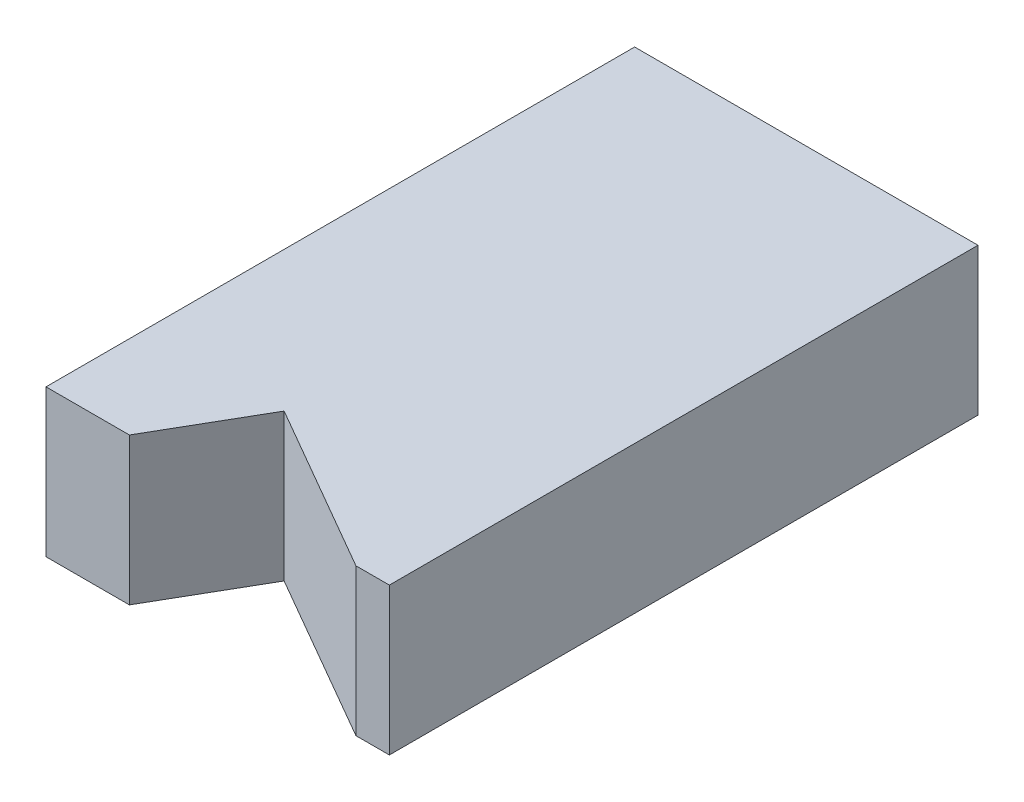
ISO-10303-21;
HEADER;
FILE_DESCRIPTION(('STEP AP214'),'2;1');
FILE_NAME('part.step','',(''),(''),'','','');
FILE_SCHEMA(('AUTOMOTIVE_DESIGN { 1 0 10303 214 1 1 1 1 }'));
ENDSEC;
DATA;
#1=APPLICATION_CONTEXT('core data for automotive mechanical design processes');
#2=APPLICATION_PROTOCOL_DEFINITION('international standard','automotive_design',2000,#1);
#3=PRODUCT_CONTEXT('',#1,'mechanical');
#4=PRODUCT('Part','Part','',(#3));
#5=PRODUCT_RELATED_PRODUCT_CATEGORY('part','',(#4));
#6=PRODUCT_DEFINITION_FORMATION('','',#4);
#7=PRODUCT_DEFINITION_CONTEXT('part definition',#1,'design');
#8=PRODUCT_DEFINITION('design','',#6,#7);
#9=PRODUCT_DEFINITION_SHAPE('','',#8);
#10=(LENGTH_UNIT() NAMED_UNIT(*) SI_UNIT(.MILLI.,.METRE.));
#11=(NAMED_UNIT(*) PLANE_ANGLE_UNIT() SI_UNIT($,.RADIAN.));
#12=(NAMED_UNIT(*) SI_UNIT($,.STERADIAN.) SOLID_ANGLE_UNIT());
#13=UNCERTAINTY_MEASURE_WITH_UNIT(LENGTH_MEASURE(1.E-05),#10,'distance_accuracy_value','');
#14=(GEOMETRIC_REPRESENTATION_CONTEXT(3) GLOBAL_UNCERTAINTY_ASSIGNED_CONTEXT((#13)) GLOBAL_UNIT_ASSIGNED_CONTEXT((#10,
#11,#12)) REPRESENTATION_CONTEXT('',''));
#15=CARTESIAN_POINT('',(0.,0.,0.));
#16=DIRECTION('',(0.,0.,1.));
#17=DIRECTION('',(1.,0.,0.));
#18=AXIS2_PLACEMENT_3D('',#15,#16,#17);
#19=CARTESIAN_POINT('',(0.,0.,152.4));
#20=DIRECTION('',(0.,0.,-1.));
#21=DIRECTION('',(-1.,0.,0.));
#22=AXIS2_PLACEMENT_3D('',#19,#20,#21);
#23=PLANE('',#22);
#24=DIRECTION('',(1.,0.,0.));
#25=VECTOR('',#24,1.);
#26=CARTESIAN_POINT('',(0.,38.1,152.4));
#27=LINE('',#26,#25);
#28=CARTESIAN_POINT('',(92.9487873496666,38.1,152.4));
#29=VERTEX_POINT('',#28);
#30=CARTESIAN_POINT('',(101.6,38.1,152.4));
#31=VERTEX_POINT('',#30);
#32=EDGE_CURVE('E163',#29,#31,#27,.T.);
#33=ORIENTED_EDGE('',*,*,#32,.F.);
#34=DIRECTION('',(0.,1.,0.));
#35=VECTOR('',#34,1.);
#36=CARTESIAN_POINT('',(92.9487873496661,-237.595244060145,152.4));
#37=LINE('',#36,#35);
#38=CARTESIAN_POINT('',(92.9487873496666,0.,152.4));
#39=VERTEX_POINT('',#38);
#40=EDGE_CURVE('E152',#39,#29,#37,.T.);
#41=ORIENTED_EDGE('',*,*,#40,.F.);
#42=DIRECTION('',(1.,0.,0.));
#43=VECTOR('',#42,1.);
#44=CARTESIAN_POINT('',(0.,0.,152.4));
#45=LINE('',#44,#43);
#46=CARTESIAN_POINT('',(101.6,0.,152.4));
#47=VERTEX_POINT('',#46);
#48=EDGE_CURVE('E129',#39,#47,#45,.T.);
#49=ORIENTED_EDGE('',*,*,#48,.T.);
#50=DIRECTION('',(0.,1.,0.));
#51=VECTOR('',#50,1.);
#52=CARTESIAN_POINT('',(101.6,0.,152.4));
#53=LINE('',#52,#51);
#54=EDGE_CURVE('E133',#47,#31,#53,.T.);
#55=ORIENTED_EDGE('',*,*,#54,.T.);
#56=EDGE_LOOP('',(#33,#41,#49,#55));
#57=FACE_BOUND('',#56,.T.);
#58=ADVANCED_FACE('F39',(#57),#23,.F.);
#59=CARTESIAN_POINT('',(101.6,0.,152.4));
#60=DIRECTION('',(-1.,0.,0.));
#61=DIRECTION('',(0.,0.,1.));
#62=AXIS2_PLACEMENT_3D('',#59,#60,#61);
#63=PLANE('',#62);
#64=DIRECTION('',(0.,0.,1.));
#65=VECTOR('',#64,1.);
#66=CARTESIAN_POINT('',(101.6,38.1,0.));
#67=LINE('',#66,#65);
#68=CARTESIAN_POINT('',(101.6,38.1,0.));
#69=VERTEX_POINT('',#68);
#70=EDGE_CURVE('E170',#69,#31,#67,.T.);
#71=ORIENTED_EDGE('',*,*,#70,.T.);
#72=ORIENTED_EDGE('',*,*,#54,.F.);
#73=DIRECTION('',(0.,0.,-1.));
#74=VECTOR('',#73,1.);
#75=CARTESIAN_POINT('',(101.6,0.,152.4));
#76=LINE('',#75,#74);
#77=CARTESIAN_POINT('',(101.6,0.,0.));
#78=VERTEX_POINT('',#77);
#79=EDGE_CURVE('E48',#47,#78,#76,.T.);
#80=ORIENTED_EDGE('',*,*,#79,.T.);
#81=DIRECTION('',(0.,1.,0.));
#82=VECTOR('',#81,1.);
#83=CARTESIAN_POINT('',(101.6,0.,0.));
#84=LINE('',#83,#82);
#85=EDGE_CURVE('E123',#78,#69,#84,.T.);
#86=ORIENTED_EDGE('',*,*,#85,.T.);
#87=EDGE_LOOP('',(#71,#72,#80,#86));
#88=FACE_BOUND('',#87,.T.);
#89=ADVANCED_FACE('F180',(#88),#63,.F.);
#90=DIRECTION('',(1.,0.,0.));
#91=VECTOR('',#90,1.);
#92=CARTESIAN_POINT('',(0.,38.1,152.4));
#93=LINE('',#92,#91);
#94=CARTESIAN_POINT('',(12.7,38.1,152.4));
#95=VERTEX_POINT('',#94);
#96=CARTESIAN_POINT('',(34.29,38.1,152.4));
#97=VERTEX_POINT('',#96);
#98=EDGE_CURVE('E166',#95,#97,#93,.T.);
#99=ORIENTED_EDGE('',*,*,#98,.F.);
#100=DIRECTION('',(0.,-1.,0.));
#101=VECTOR('',#100,1.);
#102=CARTESIAN_POINT('',(12.7,0.,152.4));
#103=LINE('',#102,#101);
#104=CARTESIAN_POINT('',(12.7,0.,152.4));
#105=VERTEX_POINT('',#104);
#106=EDGE_CURVE('E157',#95,#105,#103,.T.);
#107=ORIENTED_EDGE('',*,*,#106,.T.);
#108=CARTESIAN_POINT('',(34.29,0.,152.4));
#109=VERTEX_POINT('',#108);
#110=EDGE_CURVE('E117',#105,#109,#45,.T.);
#111=ORIENTED_EDGE('',*,*,#110,.T.);
#112=DIRECTION('',(0.,1.,0.));
#113=VECTOR('',#112,1.);
#114=CARTESIAN_POINT('',(34.29,-237.595244060145,152.4));
#115=LINE('',#114,#113);
#116=EDGE_CURVE('E149',#109,#97,#115,.T.);
#117=ORIENTED_EDGE('',*,*,#116,.T.);
#118=EDGE_LOOP('',(#99,#107,#111,#117));
#119=FACE_BOUND('',#118,.T.);
#120=ADVANCED_FACE('F182',(#119),#23,.F.);
#121=CARTESIAN_POINT('',(0.,0.,0.));
#122=DIRECTION('',(0.,0.,-1.));
#123=DIRECTION('',(-1.,0.,0.));
#124=AXIS2_PLACEMENT_3D('',#121,#122,#123);
#125=PLANE('',#124);
#126=DIRECTION('',(0.,1.,0.));
#127=VECTOR('',#126,1.);
#128=CARTESIAN_POINT('',(12.7,0.,0.));
#129=LINE('',#128,#127);
#130=CARTESIAN_POINT('',(12.7,0.,0.));
#131=VERTEX_POINT('',#130);
#132=CARTESIAN_POINT('',(12.7,38.1,0.));
#133=VERTEX_POINT('',#132);
#134=EDGE_CURVE('E100',#131,#133,#129,.T.);
#135=ORIENTED_EDGE('',*,*,#134,.T.);
#136=DIRECTION('',(-1.,0.,0.));
#137=VECTOR('',#136,1.);
#138=CARTESIAN_POINT('',(0.,38.1,0.));
#139=LINE('',#138,#137);
#140=EDGE_CURVE('E111',#69,#133,#139,.T.);
#141=ORIENTED_EDGE('',*,*,#140,.F.);
#142=ORIENTED_EDGE('',*,*,#85,.F.);
#143=DIRECTION('',(1.,0.,0.));
#144=VECTOR('',#143,1.);
#145=CARTESIAN_POINT('',(0.,0.,0.));
#146=LINE('',#145,#144);
#147=EDGE_CURVE('E115',#131,#78,#146,.T.);
#148=ORIENTED_EDGE('',*,*,#147,.F.);
#149=EDGE_LOOP('',(#135,#141,#142,#148));
#150=FACE_BOUND('',#149,.T.);
#151=ADVANCED_FACE('F121',(#150),#125,.T.);
#152=CARTESIAN_POINT('',(34.29,-237.595244060145,152.4));
#153=DIRECTION('',(0.86602540378444,0.,0.499999999999998));
#154=DIRECTION('',(0.499999999999998,0.,-0.86602540378444));
#155=AXIS2_PLACEMENT_3D('',#152,#153,#154);
#156=PLANE('',#155);
#157=DIRECTION('',(0.,1.,0.));
#158=VECTOR('',#157,1.);
#159=CARTESIAN_POINT('',(48.9546968374166,-237.595244060145,127.));
#160=LINE('',#159,#158);
#161=CARTESIAN_POINT('',(48.9546968374166,0.,127.));
#162=VERTEX_POINT('',#161);
#163=CARTESIAN_POINT('',(48.9546968374166,38.1,127.));
#164=VERTEX_POINT('',#163);
#165=EDGE_CURVE('E153',#162,#164,#160,.T.);
#166=ORIENTED_EDGE('',*,*,#165,.T.);
#167=DIRECTION('',(-0.499999999999998,0.,0.86602540378444));
#168=VECTOR('',#167,1.);
#169=CARTESIAN_POINT('',(34.29,38.1,152.4));
#170=LINE('',#169,#168);
#171=EDGE_CURVE('E55',#164,#97,#170,.T.);
#172=ORIENTED_EDGE('',*,*,#171,.T.);
#173=ORIENTED_EDGE('',*,*,#116,.F.);
#174=DIRECTION('',(0.499999999999998,0.,-0.86602540378444));
#175=VECTOR('',#174,1.);
#176=CARTESIAN_POINT('',(25.7175000000001,0.,167.248005547884));
#177=LINE('',#176,#175);
#178=EDGE_CURVE('E125',#109,#162,#177,.T.);
#179=ORIENTED_EDGE('',*,*,#178,.T.);
#180=EDGE_LOOP('',(#166,#172,#173,#179));
#181=FACE_BOUND('',#180,.T.);
#182=ADVANCED_FACE('F190',(#181),#156,.T.);
#183=CARTESIAN_POINT('',(48.9546968374166,-237.595244060145,127.));
#184=DIRECTION('',(-0.499999999999999,0.,0.866025403784439));
#185=DIRECTION('',(0.866025403784439,0.,0.499999999999999));
#186=AXIS2_PLACEMENT_3D('',#183,#184,#185);
#187=PLANE('',#186);
#188=ORIENTED_EDGE('',*,*,#40,.T.);
#189=DIRECTION('',(-0.866025403784439,0.,-0.499999999999999));
#190=VECTOR('',#189,1.);
#191=CARTESIAN_POINT('',(48.9546968374165,38.1,127.));
#192=LINE('',#191,#190);
#193=EDGE_CURVE('E11',#29,#164,#192,.T.);
#194=ORIENTED_EDGE('',*,*,#193,.T.);
#195=ORIENTED_EDGE('',*,*,#165,.F.);
#196=DIRECTION('',(0.866025403784439,0.,0.499999999999999));
#197=VECTOR('',#196,1.);
#198=CARTESIAN_POINT('',(23.2371968374165,0.,112.151994452116));
#199=LINE('',#198,#197);
#200=EDGE_CURVE('E62',#162,#39,#199,.T.);
#201=ORIENTED_EDGE('',*,*,#200,.T.);
#202=EDGE_LOOP('',(#188,#194,#195,#201));
#203=FACE_BOUND('',#202,.T.);
#204=ADVANCED_FACE('F194',(#203),#187,.T.);
#205=CARTESIAN_POINT('',(0.,0.,152.4));
#206=DIRECTION('',(0.,1.,0.));
#207=DIRECTION('',(0.,0.,1.));
#208=AXIS2_PLACEMENT_3D('',#205,#206,#207);
#209=PLANE('',#208);
#210=ORIENTED_EDGE('',*,*,#110,.F.);
#211=DIRECTION('',(0.,0.,1.));
#212=VECTOR('',#211,1.);
#213=CARTESIAN_POINT('',(12.7,0.,0.));
#214=LINE('',#213,#212);
#215=EDGE_CURVE('E103',#131,#105,#214,.T.);
#216=ORIENTED_EDGE('',*,*,#215,.F.);
#217=ORIENTED_EDGE('',*,*,#147,.T.);
#218=ORIENTED_EDGE('',*,*,#79,.F.);
#219=ORIENTED_EDGE('',*,*,#48,.F.);
#220=ORIENTED_EDGE('',*,*,#200,.F.);
#221=ORIENTED_EDGE('',*,*,#178,.F.);
#222=EDGE_LOOP('',(#210,#216,#217,#218,#219,#220,#221));
#223=FACE_BOUND('',#222,.T.);
#224=ADVANCED_FACE('F41',(#223),#209,.F.);
#225=CARTESIAN_POINT('',(12.7,0.,0.));
#226=DIRECTION('',(1.,0.,0.));
#227=DIRECTION('',(0.,0.,-1.));
#228=AXIS2_PLACEMENT_3D('',#225,#226,#227);
#229=PLANE('',#228);
#230=DIRECTION('',(0.,0.,1.));
#231=VECTOR('',#230,1.);
#232=CARTESIAN_POINT('',(12.7,38.1,0.));
#233=LINE('',#232,#231);
#234=EDGE_CURVE('E106',#133,#95,#233,.T.);
#235=ORIENTED_EDGE('',*,*,#234,.F.);
#236=ORIENTED_EDGE('',*,*,#134,.F.);
#237=ORIENTED_EDGE('',*,*,#215,.T.);
#238=ORIENTED_EDGE('',*,*,#106,.F.);
#239=EDGE_LOOP('',(#235,#236,#237,#238));
#240=FACE_BOUND('',#239,.T.);
#241=ADVANCED_FACE('F102',(#240),#229,.F.);
#242=CARTESIAN_POINT('',(0.,38.1,0.));
#243=DIRECTION('',(0.,1.,0.));
#244=DIRECTION('',(-1.,0.,0.));
#245=AXIS2_PLACEMENT_3D('',#242,#243,#244);
#246=PLANE('',#245);
#247=ORIENTED_EDGE('',*,*,#32,.T.);
#248=ORIENTED_EDGE('',*,*,#70,.F.);
#249=ORIENTED_EDGE('',*,*,#140,.T.);
#250=ORIENTED_EDGE('',*,*,#234,.T.);
#251=ORIENTED_EDGE('',*,*,#98,.T.);
#252=ORIENTED_EDGE('',*,*,#171,.F.);
#253=ORIENTED_EDGE('',*,*,#193,.F.);
#254=EDGE_LOOP('',(#247,#248,#249,#250,#251,#252,#253));
#255=FACE_BOUND('',#254,.T.);
#256=ADVANCED_FACE('F178',(#255),#246,.T.);
#257=CLOSED_SHELL('',(#58,#89,#120,#151,#182,#204,#224,#241,#256));
#258=MANIFOLD_SOLID_BREP('B2',#257);
#259=ADVANCED_BREP_SHAPE_REPRESENTATION('',(#18,#258),#14);
#260=SHAPE_DEFINITION_REPRESENTATION(#9,#259);
ENDSEC;
END-ISO-10303-21;
